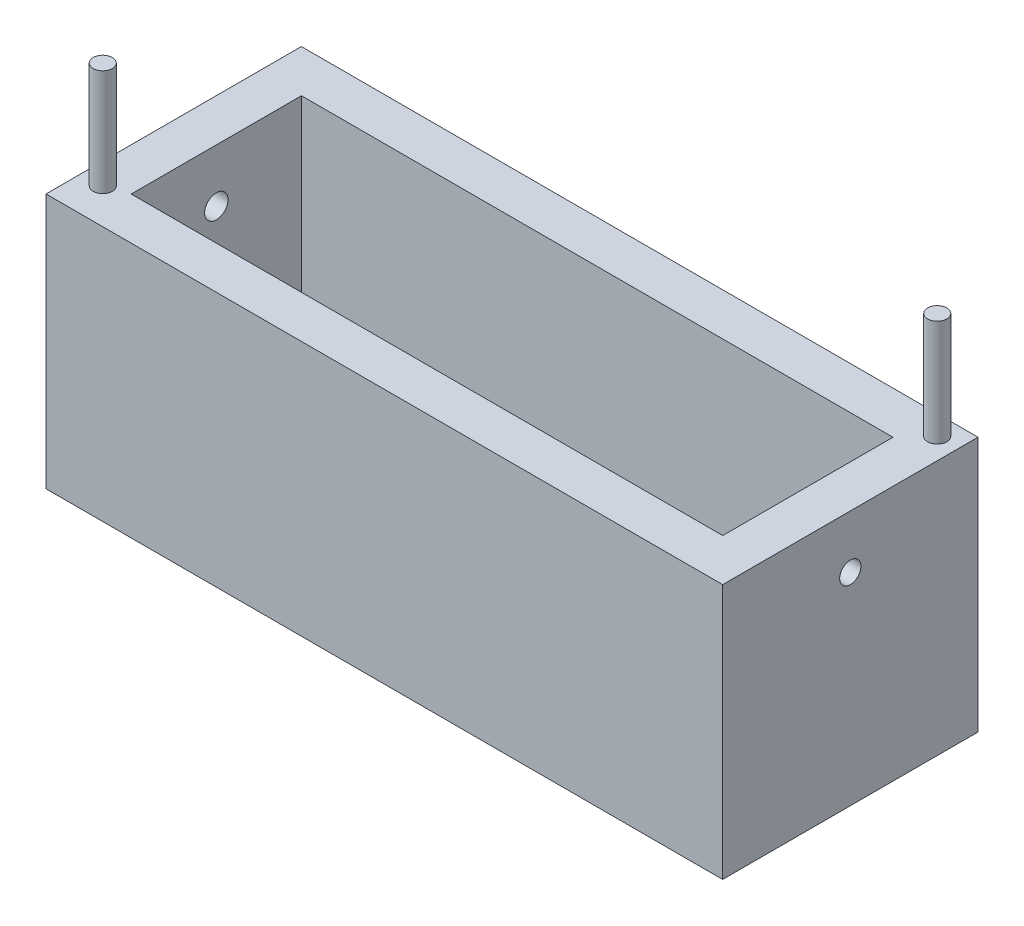
ISO-10303-21;
HEADER;
FILE_DESCRIPTION(('STEP AP214'),'2;1');
FILE_NAME('part.step','',(''),(''),'','','');
FILE_SCHEMA(('AUTOMOTIVE_DESIGN { 1 0 10303 214 1 1 1 1 }'));
ENDSEC;
DATA;
#1=APPLICATION_CONTEXT('core data for automotive mechanical design processes');
#2=APPLICATION_PROTOCOL_DEFINITION('international standard','automotive_design',2000,#1);
#3=PRODUCT_CONTEXT('',#1,'mechanical');
#4=PRODUCT('Part','Part','',(#3));
#5=PRODUCT_RELATED_PRODUCT_CATEGORY('part','',(#4));
#6=PRODUCT_DEFINITION_FORMATION('','',#4);
#7=PRODUCT_DEFINITION_CONTEXT('part definition',#1,'design');
#8=PRODUCT_DEFINITION('design','',#6,#7);
#9=PRODUCT_DEFINITION_SHAPE('','',#8);
#10=(LENGTH_UNIT() NAMED_UNIT(*) SI_UNIT(.MILLI.,.METRE.));
#11=(NAMED_UNIT(*) PLANE_ANGLE_UNIT() SI_UNIT($,.RADIAN.));
#12=(NAMED_UNIT(*) SI_UNIT($,.STERADIAN.) SOLID_ANGLE_UNIT());
#13=UNCERTAINTY_MEASURE_WITH_UNIT(LENGTH_MEASURE(1.E-05),#10,'distance_accuracy_value','');
#14=(GEOMETRIC_REPRESENTATION_CONTEXT(3) GLOBAL_UNCERTAINTY_ASSIGNED_CONTEXT((#13)) GLOBAL_UNIT_ASSIGNED_CONTEXT((#10,
#11,#12)) REPRESENTATION_CONTEXT('',''));
#15=CARTESIAN_POINT('',(0.,0.,0.));
#16=DIRECTION('',(0.,0.,1.));
#17=DIRECTION('',(1.,0.,0.));
#18=AXIS2_PLACEMENT_3D('',#15,#16,#17);
#19=CARTESIAN_POINT('',(0.,152.4,152.4));
#20=DIRECTION('',(0.,-1.,0.));
#21=DIRECTION('',(1.,0.,0.));
#22=AXIS2_PLACEMENT_3D('',#19,#20,#21);
#23=PLANE('',#22);
#24=CARTESIAN_POINT('',(391.218879989009,152.4,11.6902070890887));
#25=DIRECTION('',(0.,-1.,0.));
#26=DIRECTION('',(1.,0.,0.));
#27=AXIS2_PLACEMENT_3D('',#24,#25,#26);
#28=CIRCLE('',#27,5.71500000000004);
#29=CARTESIAN_POINT('',(396.933879989009,152.4,11.6902070890887));
#30=VERTEX_POINT('',#29);
#31=EDGE_CURVE('E11',#30,#30,#28,.F.);
#32=ORIENTED_EDGE('',*,*,#31,.F.);
#33=EDGE_LOOP('',(#32));
#34=FACE_BOUND('',#33,.T.);
#35=CARTESIAN_POINT('',(12.7588799890094,152.4,131.284542217657));
#36=DIRECTION('',(0.,-1.,0.));
#37=DIRECTION('',(1.,0.,0.));
#38=AXIS2_PLACEMENT_3D('',#35,#36,#37);
#39=CIRCLE('',#38,5.715);
#40=CARTESIAN_POINT('',(18.4738799890094,152.4,131.284542217657));
#41=VERTEX_POINT('',#40);
#42=EDGE_CURVE('E42',#41,#41,#39,.F.);
#43=ORIENTED_EDGE('',*,*,#42,.F.);
#44=EDGE_LOOP('',(#43));
#45=FACE_BOUND('',#44,.T.);
#46=DIRECTION('',(-1.,0.,0.));
#47=VECTOR('',#46,1.);
#48=CARTESIAN_POINT('',(0.,152.4,0.));
#49=LINE('',#48,#47);
#50=CARTESIAN_POINT('',(403.86,152.4,0.));
#51=VERTEX_POINT('',#50);
#52=CARTESIAN_POINT('',(0.,152.4,0.));
#53=VERTEX_POINT('',#52);
#54=EDGE_CURVE('E80',#51,#53,#49,.T.);
#55=ORIENTED_EDGE('',*,*,#54,.T.);
#56=DIRECTION('',(0.,0.,-1.));
#57=VECTOR('',#56,1.);
#58=CARTESIAN_POINT('',(0.,152.4,152.4));
#59=LINE('',#58,#57);
#60=CARTESIAN_POINT('',(0.,152.4,152.4));
#61=VERTEX_POINT('',#60);
#62=EDGE_CURVE('E146',#61,#53,#59,.T.);
#63=ORIENTED_EDGE('',*,*,#62,.F.);
#64=DIRECTION('',(-1.,0.,0.));
#65=VECTOR('',#64,1.);
#66=CARTESIAN_POINT('',(0.,152.4,152.4));
#67=LINE('',#66,#65);
#68=CARTESIAN_POINT('',(403.86,152.4,152.4));
#69=VERTEX_POINT('',#68);
#70=EDGE_CURVE('E59',#69,#61,#67,.T.);
#71=ORIENTED_EDGE('',*,*,#70,.F.);
#72=DIRECTION('',(0.,0.,-1.));
#73=VECTOR('',#72,1.);
#74=CARTESIAN_POINT('',(403.86,152.4,152.4));
#75=LINE('',#74,#73);
#76=EDGE_CURVE('E153',#69,#51,#75,.T.);
#77=ORIENTED_EDGE('',*,*,#76,.T.);
#78=EDGE_LOOP('',(#55,#63,#71,#77));
#79=FACE_BOUND('',#78,.T.);
#80=DIRECTION('',(1.,0.,0.));
#81=VECTOR('',#80,1.);
#82=CARTESIAN_POINT('',(25.4588799890094,152.4,25.4));
#83=LINE('',#82,#81);
#84=CARTESIAN_POINT('',(25.4588799890094,152.4,25.4));
#85=VERTEX_POINT('',#84);
#86=CARTESIAN_POINT('',(378.518879989009,152.4,25.4));
#87=VERTEX_POINT('',#86);
#88=EDGE_CURVE('E50',#85,#87,#83,.T.);
#89=ORIENTED_EDGE('',*,*,#88,.T.);
#90=DIRECTION('',(0.,0.,1.));
#91=VECTOR('',#90,1.);
#92=CARTESIAN_POINT('',(378.518879989009,152.4,25.4));
#93=LINE('',#92,#91);
#94=CARTESIAN_POINT('',(378.518879989009,152.4,127.));
#95=VERTEX_POINT('',#94);
#96=EDGE_CURVE('E130',#87,#95,#93,.T.);
#97=ORIENTED_EDGE('',*,*,#96,.T.);
#98=DIRECTION('',(1.,0.,0.));
#99=VECTOR('',#98,1.);
#100=CARTESIAN_POINT('',(25.4588799890094,152.4,127.));
#101=LINE('',#100,#99);
#102=CARTESIAN_POINT('',(25.4588799890094,152.4,127.));
#103=VERTEX_POINT('',#102);
#104=EDGE_CURVE('E185',#103,#95,#101,.T.);
#105=ORIENTED_EDGE('',*,*,#104,.F.);
#106=DIRECTION('',(0.,0.,1.));
#107=VECTOR('',#106,1.);
#108=CARTESIAN_POINT('',(25.4588799890094,152.4,25.4));
#109=LINE('',#108,#107);
#110=EDGE_CURVE('E126',#85,#103,#109,.T.);
#111=ORIENTED_EDGE('',*,*,#110,.F.);
#112=EDGE_LOOP('',(#89,#97,#105,#111));
#113=FACE_BOUND('',#112,.T.);
#114=ADVANCED_FACE('F33',(#34,#45,#79,#113),#23,.F.);
#115=CARTESIAN_POINT('',(0.,0.,152.4));
#116=DIRECTION('',(1.,0.,0.));
#117=DIRECTION('',(0.,1.,0.));
#118=AXIS2_PLACEMENT_3D('',#115,#116,#117);
#119=PLANE('',#118);
#120=CARTESIAN_POINT('',(0.,120.65,76.2));
#121=DIRECTION('',(-1.,0.,0.));
#122=DIRECTION('',(0.,-1.,0.));
#123=AXIS2_PLACEMENT_3D('',#120,#121,#122);
#124=CIRCLE('',#123,6.98500000000001);
#125=CARTESIAN_POINT('',(0.,113.665,76.2));
#126=VERTEX_POINT('',#125);
#127=EDGE_CURVE('E175',#126,#126,#124,.T.);
#128=ORIENTED_EDGE('',*,*,#127,.F.);
#129=EDGE_LOOP('',(#128));
#130=FACE_BOUND('',#129,.T.);
#131=DIRECTION('',(0.,-1.,0.));
#132=VECTOR('',#131,1.);
#133=CARTESIAN_POINT('',(0.,0.,0.));
#134=LINE('',#133,#132);
#135=CARTESIAN_POINT('',(0.,0.,0.));
#136=VERTEX_POINT('',#135);
#137=EDGE_CURVE('E131',#53,#136,#134,.T.);
#138=ORIENTED_EDGE('',*,*,#137,.T.);
#139=DIRECTION('',(0.,0.,-1.));
#140=VECTOR('',#139,1.);
#141=CARTESIAN_POINT('',(0.,0.,152.4));
#142=LINE('',#141,#140);
#143=CARTESIAN_POINT('',(0.,0.,152.4));
#144=VERTEX_POINT('',#143);
#145=EDGE_CURVE('E158',#144,#136,#142,.T.);
#146=ORIENTED_EDGE('',*,*,#145,.F.);
#147=DIRECTION('',(0.,-1.,0.));
#148=VECTOR('',#147,1.);
#149=CARTESIAN_POINT('',(0.,0.,152.4));
#150=LINE('',#149,#148);
#151=EDGE_CURVE('E141',#61,#144,#150,.T.);
#152=ORIENTED_EDGE('',*,*,#151,.F.);
#153=ORIENTED_EDGE('',*,*,#62,.T.);
#154=EDGE_LOOP('',(#138,#146,#152,#153));
#155=FACE_BOUND('',#154,.T.);
#156=ADVANCED_FACE('F35',(#130,#155),#119,.F.);
#157=CARTESIAN_POINT('',(0.,0.,152.4));
#158=DIRECTION('',(0.,1.,0.));
#159=DIRECTION('',(0.,0.,1.));
#160=AXIS2_PLACEMENT_3D('',#157,#158,#159);
#161=PLANE('',#160);
#162=DIRECTION('',(1.,0.,0.));
#163=VECTOR('',#162,1.);
#164=CARTESIAN_POINT('',(0.,0.,0.));
#165=LINE('',#164,#163);
#166=CARTESIAN_POINT('',(403.86,0.,0.));
#167=VERTEX_POINT('',#166);
#168=EDGE_CURVE('E135',#136,#167,#165,.T.);
#169=ORIENTED_EDGE('',*,*,#168,.T.);
#170=DIRECTION('',(0.,0.,-1.));
#171=VECTOR('',#170,1.);
#172=CARTESIAN_POINT('',(403.86,0.,152.4));
#173=LINE('',#172,#171);
#174=CARTESIAN_POINT('',(403.86,0.,152.4));
#175=VERTEX_POINT('',#174);
#176=EDGE_CURVE('E155',#175,#167,#173,.T.);
#177=ORIENTED_EDGE('',*,*,#176,.F.);
#178=DIRECTION('',(1.,0.,0.));
#179=VECTOR('',#178,1.);
#180=CARTESIAN_POINT('',(0.,0.,152.4));
#181=LINE('',#180,#179);
#182=EDGE_CURVE('E88',#144,#175,#181,.T.);
#183=ORIENTED_EDGE('',*,*,#182,.F.);
#184=ORIENTED_EDGE('',*,*,#145,.T.);
#185=EDGE_LOOP('',(#169,#177,#183,#184));
#186=FACE_BOUND('',#185,.T.);
#187=ADVANCED_FACE('F203',(#186),#161,.F.);
#188=CARTESIAN_POINT('',(403.86,0.,152.4));
#189=DIRECTION('',(-1.,0.,0.));
#190=DIRECTION('',(0.,-1.,0.));
#191=AXIS2_PLACEMENT_3D('',#188,#189,#190);
#192=PLANE('',#191);
#193=CARTESIAN_POINT('',(403.86,120.65,76.2));
#194=DIRECTION('',(1.,0.,0.));
#195=DIRECTION('',(0.,1.,0.));
#196=AXIS2_PLACEMENT_3D('',#193,#194,#195);
#197=CIRCLE('',#196,6.34999999999999);
#198=CARTESIAN_POINT('',(403.86,127.,76.2));
#199=VERTEX_POINT('',#198);
#200=EDGE_CURVE('E164',#199,#199,#197,.T.);
#201=ORIENTED_EDGE('',*,*,#200,.F.);
#202=EDGE_LOOP('',(#201));
#203=FACE_BOUND('',#202,.T.);
#204=DIRECTION('',(0.,1.,0.));
#205=VECTOR('',#204,1.);
#206=CARTESIAN_POINT('',(403.86,0.,0.));
#207=LINE('',#206,#205);
#208=EDGE_CURVE('E149',#167,#51,#207,.T.);
#209=ORIENTED_EDGE('',*,*,#208,.T.);
#210=ORIENTED_EDGE('',*,*,#76,.F.);
#211=DIRECTION('',(0.,1.,0.));
#212=VECTOR('',#211,1.);
#213=CARTESIAN_POINT('',(403.86,0.,152.4));
#214=LINE('',#213,#212);
#215=EDGE_CURVE('E144',#175,#69,#214,.T.);
#216=ORIENTED_EDGE('',*,*,#215,.F.);
#217=ORIENTED_EDGE('',*,*,#176,.T.);
#218=EDGE_LOOP('',(#209,#210,#216,#217));
#219=FACE_BOUND('',#218,.T.);
#220=ADVANCED_FACE('F211',(#203,#219),#192,.F.);
#221=CARTESIAN_POINT('',(0.,0.,152.4));
#222=DIRECTION('',(0.,0.,-1.));
#223=DIRECTION('',(-1.,0.,0.));
#224=AXIS2_PLACEMENT_3D('',#221,#222,#223);
#225=PLANE('',#224);
#226=ORIENTED_EDGE('',*,*,#151,.T.);
#227=ORIENTED_EDGE('',*,*,#182,.T.);
#228=ORIENTED_EDGE('',*,*,#215,.T.);
#229=ORIENTED_EDGE('',*,*,#70,.T.);
#230=EDGE_LOOP('',(#226,#227,#228,#229));
#231=FACE_BOUND('',#230,.T.);
#232=ADVANCED_FACE('F213',(#231),#225,.F.);
#233=CARTESIAN_POINT('',(0.,0.,0.));
#234=DIRECTION('',(0.,0.,-1.));
#235=DIRECTION('',(-1.,0.,0.));
#236=AXIS2_PLACEMENT_3D('',#233,#234,#235);
#237=PLANE('',#236);
#238=ORIENTED_EDGE('',*,*,#137,.F.);
#239=ORIENTED_EDGE('',*,*,#54,.F.);
#240=ORIENTED_EDGE('',*,*,#208,.F.);
#241=ORIENTED_EDGE('',*,*,#168,.F.);
#242=EDGE_LOOP('',(#238,#239,#240,#241));
#243=FACE_BOUND('',#242,.T.);
#244=ADVANCED_FACE('F209',(#243),#237,.T.);
#245=CARTESIAN_POINT('',(25.4588799890094,12.7,25.4));
#246=DIRECTION('',(0.,0.,1.));
#247=DIRECTION('',(1.,0.,0.));
#248=AXIS2_PLACEMENT_3D('',#245,#246,#247);
#249=PLANE('',#248);
#250=ORIENTED_EDGE('',*,*,#88,.F.);
#251=DIRECTION('',(0.,1.,0.));
#252=VECTOR('',#251,1.);
#253=CARTESIAN_POINT('',(25.4588799890094,12.7,25.4));
#254=LINE('',#253,#252);
#255=CARTESIAN_POINT('',(25.4588799890094,12.7,25.4));
#256=VERTEX_POINT('',#255);
#257=EDGE_CURVE('E125',#256,#85,#254,.T.);
#258=ORIENTED_EDGE('',*,*,#257,.F.);
#259=DIRECTION('',(1.,0.,0.));
#260=VECTOR('',#259,1.);
#261=CARTESIAN_POINT('',(25.4588799890094,12.7,25.4));
#262=LINE('',#261,#260);
#263=CARTESIAN_POINT('',(378.518879989009,12.7,25.4));
#264=VERTEX_POINT('',#263);
#265=EDGE_CURVE('E115',#256,#264,#262,.T.);
#266=ORIENTED_EDGE('',*,*,#265,.T.);
#267=DIRECTION('',(0.,1.,0.));
#268=VECTOR('',#267,1.);
#269=CARTESIAN_POINT('',(378.518879989009,12.7,25.4));
#270=LINE('',#269,#268);
#271=EDGE_CURVE('E124',#264,#87,#270,.T.);
#272=ORIENTED_EDGE('',*,*,#271,.T.);
#273=EDGE_LOOP('',(#250,#258,#266,#272));
#274=FACE_BOUND('',#273,.T.);
#275=ADVANCED_FACE('F123',(#274),#249,.T.);
#276=CARTESIAN_POINT('',(378.518879989009,12.7,25.4));
#277=DIRECTION('',(-1.,0.,0.));
#278=DIRECTION('',(0.,-1.,0.));
#279=AXIS2_PLACEMENT_3D('',#276,#277,#278);
#280=PLANE('',#279);
#281=CARTESIAN_POINT('',(378.518879989009,120.65,76.2));
#282=DIRECTION('',(-1.,0.,0.));
#283=DIRECTION('',(0.,-1.,0.));
#284=AXIS2_PLACEMENT_3D('',#281,#282,#283);
#285=CIRCLE('',#284,6.34999999999999);
#286=CARTESIAN_POINT('',(378.518879989009,114.3,76.2));
#287=VERTEX_POINT('',#286);
#288=EDGE_CURVE('E161',#287,#287,#285,.T.);
#289=ORIENTED_EDGE('',*,*,#288,.F.);
#290=EDGE_LOOP('',(#289));
#291=FACE_BOUND('',#290,.T.);
#292=ORIENTED_EDGE('',*,*,#96,.F.);
#293=ORIENTED_EDGE('',*,*,#271,.F.);
#294=DIRECTION('',(0.,0.,1.));
#295=VECTOR('',#294,1.);
#296=CARTESIAN_POINT('',(378.518879989009,12.7,25.4));
#297=LINE('',#296,#295);
#298=CARTESIAN_POINT('',(378.518879989009,12.7,127.));
#299=VERTEX_POINT('',#298);
#300=EDGE_CURVE('E111',#264,#299,#297,.T.);
#301=ORIENTED_EDGE('',*,*,#300,.T.);
#302=DIRECTION('',(0.,1.,0.));
#303=VECTOR('',#302,1.);
#304=CARTESIAN_POINT('',(378.518879989009,12.7,127.));
#305=LINE('',#304,#303);
#306=EDGE_CURVE('E132',#299,#95,#305,.T.);
#307=ORIENTED_EDGE('',*,*,#306,.T.);
#308=EDGE_LOOP('',(#292,#293,#301,#307));
#309=FACE_BOUND('',#308,.T.);
#310=ADVANCED_FACE('F128',(#291,#309),#280,.T.);
#311=CARTESIAN_POINT('',(25.4588799890094,12.7,127.));
#312=DIRECTION('',(0.,0.,1.));
#313=DIRECTION('',(1.,0.,0.));
#314=AXIS2_PLACEMENT_3D('',#311,#312,#313);
#315=PLANE('',#314);
#316=ORIENTED_EDGE('',*,*,#104,.T.);
#317=ORIENTED_EDGE('',*,*,#306,.F.);
#318=DIRECTION('',(1.,0.,0.));
#319=VECTOR('',#318,1.);
#320=CARTESIAN_POINT('',(25.4588799890094,12.7,127.));
#321=LINE('',#320,#319);
#322=CARTESIAN_POINT('',(25.4588799890094,12.7,127.));
#323=VERTEX_POINT('',#322);
#324=EDGE_CURVE('E118',#323,#299,#321,.T.);
#325=ORIENTED_EDGE('',*,*,#324,.F.);
#326=DIRECTION('',(0.,1.,0.));
#327=VECTOR('',#326,1.);
#328=CARTESIAN_POINT('',(25.4588799890094,12.7,127.));
#329=LINE('',#328,#327);
#330=EDGE_CURVE('E137',#323,#103,#329,.T.);
#331=ORIENTED_EDGE('',*,*,#330,.T.);
#332=EDGE_LOOP('',(#316,#317,#325,#331));
#333=FACE_BOUND('',#332,.T.);
#334=ADVANCED_FACE('F191',(#333),#315,.F.);
#335=CARTESIAN_POINT('',(25.4588799890094,12.7,25.4));
#336=DIRECTION('',(-1.,0.,0.));
#337=DIRECTION('',(0.,0.,1.));
#338=AXIS2_PLACEMENT_3D('',#335,#336,#337);
#339=PLANE('',#338);
#340=CARTESIAN_POINT('',(25.4588799890094,120.65,76.2));
#341=DIRECTION('',(-1.,0.,0.));
#342=DIRECTION('',(0.,0.,1.));
#343=AXIS2_PLACEMENT_3D('',#340,#341,#342);
#344=CIRCLE('',#343,6.98500000000001);
#345=CARTESIAN_POINT('',(25.4588799890094,120.65,83.185));
#346=VERTEX_POINT('',#345);
#347=EDGE_CURVE('E37',#346,#346,#344,.T.);
#348=ORIENTED_EDGE('',*,*,#347,.T.);
#349=EDGE_LOOP('',(#348));
#350=FACE_BOUND('',#349,.T.);
#351=ORIENTED_EDGE('',*,*,#110,.T.);
#352=ORIENTED_EDGE('',*,*,#330,.F.);
#353=DIRECTION('',(0.,0.,1.));
#354=VECTOR('',#353,1.);
#355=CARTESIAN_POINT('',(25.4588799890094,12.7,25.4));
#356=LINE('',#355,#354);
#357=EDGE_CURVE('E181',#256,#323,#356,.T.);
#358=ORIENTED_EDGE('',*,*,#357,.F.);
#359=ORIENTED_EDGE('',*,*,#257,.T.);
#360=EDGE_LOOP('',(#351,#352,#358,#359));
#361=FACE_BOUND('',#360,.T.);
#362=ADVANCED_FACE('F195',(#350,#361),#339,.F.);
#363=CARTESIAN_POINT('',(0.,12.7,0.));
#364=DIRECTION('',(0.,-1.,0.));
#365=DIRECTION('',(1.,0.,0.));
#366=AXIS2_PLACEMENT_3D('',#363,#364,#365);
#367=PLANE('',#366);
#368=ORIENTED_EDGE('',*,*,#265,.F.);
#369=ORIENTED_EDGE('',*,*,#357,.T.);
#370=ORIENTED_EDGE('',*,*,#324,.T.);
#371=ORIENTED_EDGE('',*,*,#300,.F.);
#372=EDGE_LOOP('',(#368,#369,#370,#371));
#373=FACE_BOUND('',#372,.T.);
#374=ADVANCED_FACE('F113',(#373),#367,.F.);
#375=CARTESIAN_POINT('',(12.7588799890094,215.9,131.284542217657));
#376=DIRECTION('',(0.,-1.,0.));
#377=DIRECTION('',(1.,0.,0.));
#378=AXIS2_PLACEMENT_3D('',#375,#376,#377);
#379=CYLINDRICAL_SURFACE('',#378,5.715);
#380=CARTESIAN_POINT('',(12.7588799890094,215.9,131.284542217657));
#381=DIRECTION('',(0.,1.,0.));
#382=DIRECTION('',(-1.,0.,0.));
#383=AXIS2_PLACEMENT_3D('',#380,#381,#382);
#384=CIRCLE('',#383,5.715);
#385=CARTESIAN_POINT('',(7.04387998900935,215.9,131.284542217657));
#386=VERTEX_POINT('',#385);
#387=EDGE_CURVE('E168',#386,#386,#384,.T.);
#388=ORIENTED_EDGE('',*,*,#387,.F.);
#389=EDGE_LOOP('',(#388));
#390=FACE_BOUND('',#389,.T.);
#391=ORIENTED_EDGE('',*,*,#42,.T.);
#392=EDGE_LOOP('',(#391));
#393=FACE_BOUND('',#392,.T.);
#394=ADVANCED_FACE('F244',(#390,#393),#379,.T.);
#395=CARTESIAN_POINT('',(12.7588799890094,215.9,131.284542217657));
#396=DIRECTION('',(0.,1.,0.));
#397=DIRECTION('',(-1.,0.,0.));
#398=AXIS2_PLACEMENT_3D('',#395,#396,#397);
#399=PLANE('',#398);
#400=ORIENTED_EDGE('',*,*,#387,.T.);
#401=EDGE_LOOP('',(#400));
#402=FACE_BOUND('',#401,.T.);
#403=ADVANCED_FACE('F247',(#402),#399,.T.);
#404=CARTESIAN_POINT('',(391.218879989009,215.9,11.6902070890887));
#405=DIRECTION('',(0.,-1.,0.));
#406=DIRECTION('',(1.,0.,0.));
#407=AXIS2_PLACEMENT_3D('',#404,#405,#406);
#408=CYLINDRICAL_SURFACE('',#407,5.71500000000004);
#409=CARTESIAN_POINT('',(391.218879989009,215.9,11.6902070890887));
#410=DIRECTION('',(0.,1.,0.));
#411=DIRECTION('',(-1.,0.,0.));
#412=AXIS2_PLACEMENT_3D('',#409,#410,#411);
#413=CIRCLE('',#412,5.71500000000004);
#414=CARTESIAN_POINT('',(385.503879989009,215.9,11.6902070890887));
#415=VERTEX_POINT('',#414);
#416=EDGE_CURVE('E163',#415,#415,#413,.T.);
#417=ORIENTED_EDGE('',*,*,#416,.F.);
#418=EDGE_LOOP('',(#417));
#419=FACE_BOUND('',#418,.T.);
#420=ORIENTED_EDGE('',*,*,#31,.T.);
#421=EDGE_LOOP('',(#420));
#422=FACE_BOUND('',#421,.T.);
#423=ADVANCED_FACE('F251',(#419,#422),#408,.T.);
#424=CARTESIAN_POINT('',(391.218879989009,215.9,11.6902070890887));
#425=DIRECTION('',(0.,1.,0.));
#426=DIRECTION('',(-1.,0.,0.));
#427=AXIS2_PLACEMENT_3D('',#424,#425,#426);
#428=PLANE('',#427);
#429=ORIENTED_EDGE('',*,*,#416,.T.);
#430=EDGE_LOOP('',(#429));
#431=FACE_BOUND('',#430,.T.);
#432=ADVANCED_FACE('F255',(#431),#428,.T.);
#433=CARTESIAN_POINT('',(101.600000000001,120.65,76.2));
#434=DIRECTION('',(1.,0.,0.));
#435=DIRECTION('',(0.,1.,0.));
#436=AXIS2_PLACEMENT_3D('',#433,#434,#435);
#437=CYLINDRICAL_SURFACE('',#436,6.34999999999999);
#438=ORIENTED_EDGE('',*,*,#288,.T.);
#439=EDGE_LOOP('',(#438));
#440=FACE_BOUND('',#439,.T.);
#441=ORIENTED_EDGE('',*,*,#200,.T.);
#442=EDGE_LOOP('',(#441));
#443=FACE_BOUND('',#442,.T.);
#444=ADVANCED_FACE('F259',(#440,#443),#437,.F.);
#445=CARTESIAN_POINT('',(68.5800000000001,120.65,76.2));
#446=DIRECTION('',(-1.,0.,0.));
#447=DIRECTION('',(0.,-1.,0.));
#448=AXIS2_PLACEMENT_3D('',#445,#446,#447);
#449=CYLINDRICAL_SURFACE('',#448,6.98500000000001);
#450=ORIENTED_EDGE('',*,*,#127,.T.);
#451=EDGE_LOOP('',(#450));
#452=FACE_BOUND('',#451,.T.);
#453=ORIENTED_EDGE('',*,*,#347,.F.);
#454=EDGE_LOOP('',(#453));
#455=FACE_BOUND('',#454,.T.);
#456=ADVANCED_FACE('F263',(#452,#455),#449,.F.);
#457=CLOSED_SHELL('',(#114,#156,#187,#220,#232,#244,#275,#310,#334,#362,#374,#394,#403,#423,
#432,#444,#456));
#458=MANIFOLD_SOLID_BREP('B2',#457);
#459=ADVANCED_BREP_SHAPE_REPRESENTATION('',(#18,#458),#14);
#460=SHAPE_DEFINITION_REPRESENTATION(#9,#459);
ENDSEC;
END-ISO-10303-21;
